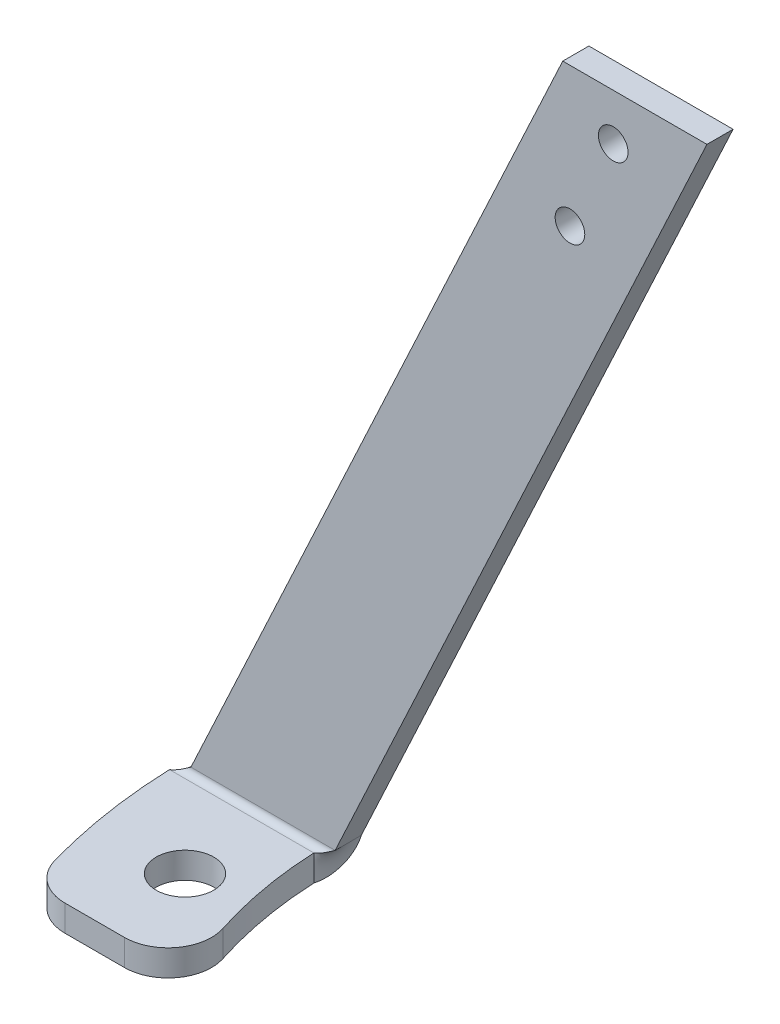
ISO-10303-21;
HEADER;
FILE_DESCRIPTION(('STEP AP214'),'2;1');
FILE_NAME('part.step','',(''),(''),'','','');
FILE_SCHEMA(('AUTOMOTIVE_DESIGN { 1 0 10303 214 1 1 1 1 }'));
ENDSEC;
DATA;
#1=APPLICATION_CONTEXT('core data for automotive mechanical design processes');
#2=APPLICATION_PROTOCOL_DEFINITION('international standard','automotive_design',2000,#1);
#3=PRODUCT_CONTEXT('',#1,'mechanical');
#4=PRODUCT('Part','Part','',(#3));
#5=PRODUCT_RELATED_PRODUCT_CATEGORY('part','',(#4));
#6=PRODUCT_DEFINITION_FORMATION('','',#4);
#7=PRODUCT_DEFINITION_CONTEXT('part definition',#1,'design');
#8=PRODUCT_DEFINITION('design','',#6,#7);
#9=PRODUCT_DEFINITION_SHAPE('','',#8);
#10=(LENGTH_UNIT() NAMED_UNIT(*) SI_UNIT(.MILLI.,.METRE.));
#11=(NAMED_UNIT(*) PLANE_ANGLE_UNIT() SI_UNIT($,.RADIAN.));
#12=(NAMED_UNIT(*) SI_UNIT($,.STERADIAN.) SOLID_ANGLE_UNIT());
#13=UNCERTAINTY_MEASURE_WITH_UNIT(LENGTH_MEASURE(1.E-05),#10,'distance_accuracy_value','');
#14=(GEOMETRIC_REPRESENTATION_CONTEXT(3) GLOBAL_UNCERTAINTY_ASSIGNED_CONTEXT((#13)) GLOBAL_UNIT_ASSIGNED_CONTEXT((#10,
#11,#12)) REPRESENTATION_CONTEXT('',''));
#15=CARTESIAN_POINT('',(0.,0.,0.));
#16=DIRECTION('',(0.,0.,1.));
#17=DIRECTION('',(1.,0.,0.));
#18=AXIS2_PLACEMENT_3D('',#15,#16,#17);
#19=CARTESIAN_POINT('',(0.,0.,1.5));
#20=DIRECTION('',(0.,0.,-1.));
#21=DIRECTION('',(-1.,0.,0.));
#22=AXIS2_PLACEMENT_3D('',#19,#20,#21);
#23=PLANE('',#22);
#24=CARTESIAN_POINT('',(-15.1911080308203,89.9268044253806,1.5));
#25=DIRECTION('',(0.,0.,1.));
#26=DIRECTION('',(1.,0.,0.));
#27=AXIS2_PLACEMENT_3D('',#24,#25,#26);
#28=CIRCLE('',#27,1.69999999999999);
#29=CARTESIAN_POINT('',(-13.4911080308203,89.9268044253806,1.5));
#30=VERTEX_POINT('',#29);
#31=EDGE_CURVE('E528',#30,#30,#28,.T.);
#32=ORIENTED_EDGE('',*,*,#31,.F.);
#33=EDGE_LOOP('',(#32));
#34=FACE_BOUND('',#33,.T.);
#35=DIRECTION('',(1.,0.,0.));
#36=VECTOR('',#35,1.);
#37=CARTESIAN_POINT('',(-47.1069260201008,3.7366,1.5));
#38=LINE('',#37,#36);
#39=CARTESIAN_POINT('',(-47.1069260201008,3.7366,1.5));
#40=VERTEX_POINT('',#39);
#41=CARTESIAN_POINT('',(-63.6575948045381,3.73659999999999,1.5));
#42=VERTEX_POINT('',#41);
#43=EDGE_CURVE('E186',#40,#42,#38,.F.);
#44=ORIENTED_EDGE('',*,*,#43,.F.);
#45=DIRECTION('',(0.422618261740693,0.906307787036653,0.));
#46=VECTOR('',#45,1.);
#47=CARTESIAN_POINT('',(-48.8493312155627,0.,1.5));
#48=LINE('',#47,#46);
#49=CARTESIAN_POINT('',(-4.43317583253723,95.2507526013277,1.5));
#50=VERTEX_POINT('',#49);
#51=EDGE_CURVE('E193',#40,#50,#48,.T.);
#52=ORIENTED_EDGE('',*,*,#51,.T.);
#53=DIRECTION('',(-1.,0.,0.));
#54=VECTOR('',#53,1.);
#55=CARTESIAN_POINT('',(-20.9838446169746,95.2507526013277,1.5));
#56=LINE('',#55,#54);
#57=CARTESIAN_POINT('',(-20.9838446169746,95.2507526013277,1.5));
#58=VERTEX_POINT('',#57);
#59=EDGE_CURVE('E302',#50,#58,#56,.T.);
#60=ORIENTED_EDGE('',*,*,#59,.T.);
#61=DIRECTION('',(-0.422618261740693,-0.906307787036653,0.));
#62=VECTOR('',#61,1.);
#63=CARTESIAN_POINT('',(-65.4,0.,1.5));
#64=LINE('',#63,#62);
#65=EDGE_CURVE('E299',#58,#42,#64,.T.);
#66=ORIENTED_EDGE('',*,*,#65,.T.);
#67=EDGE_LOOP('',(#44,#52,#60,#66));
#68=FACE_BOUND('',#67,.T.);
#69=CARTESIAN_POINT('',(-20.1563036429491,79.2789080734865,1.5));
#70=DIRECTION('',(0.,0.,1.));
#71=DIRECTION('',(1.,0.,0.));
#72=AXIS2_PLACEMENT_3D('',#69,#70,#71);
#73=CIRCLE('',#72,1.69999999999999);
#74=CARTESIAN_POINT('',(-18.4563036429491,79.2789080734865,1.5));
#75=VERTEX_POINT('',#74);
#76=EDGE_CURVE('E524',#75,#75,#73,.T.);
#77=ORIENTED_EDGE('',*,*,#76,.F.);
#78=EDGE_LOOP('',(#77));
#79=FACE_BOUND('',#78,.T.);
#80=ADVANCED_FACE('F61',(#34,#68,#79),#23,.F.);
#81=CARTESIAN_POINT('',(0.,3.00000000000001,0.));
#82=DIRECTION('',(0.,-1.,0.));
#83=DIRECTION('',(0.,0.,-1.));
#84=AXIS2_PLACEMENT_3D('',#81,#82,#83);
#85=PLANE('',#84);
#86=DIRECTION('',(-1.,0.,0.));
#87=VECTOR('',#86,1.);
#88=CARTESIAN_POINT('',(-61.7831692291679,2.99999999999993,21.5));
#89=LINE('',#88,#87);
#90=CARTESIAN_POINT('',(-51.283337626187,2.99999999999993,21.5));
#91=VERTEX_POINT('',#90);
#92=CARTESIAN_POINT('',(-58.1204611498222,2.99999999999993,21.5));
#93=VERTEX_POINT('',#92);
#94=EDGE_CURVE('E172',#91,#93,#89,.T.);
#95=ORIENTED_EDGE('',*,*,#94,.F.);
#96=CARTESIAN_POINT('',(-51.283337626187,2.99999999999995,16.5));
#97=DIRECTION('',(0.,-1.,0.));
#98=DIRECTION('',(0.,0.,-1.));
#99=AXIS2_PLACEMENT_3D('',#96,#97,#98);
#100=CIRCLE('',#99,5.);
#101=CARTESIAN_POINT('',(-46.5236295276036,2.99999999999995,14.9686023324168));
#102=VERTEX_POINT('',#101);
#103=EDGE_CURVE('E286',#91,#102,#100,.F.);
#104=ORIENTED_EDGE('',*,*,#103,.T.);
#105=CARTESIAN_POINT('',(0.,3.00000000000001,0.));
#106=DIRECTION('',(0.,-1.,0.));
#107=DIRECTION('',(0.,0.,-1.));
#108=AXIS2_PLACEMENT_3D('',#105,#106,#107);
#109=CIRCLE('',#108,48.8723557873748);
#110=CARTESIAN_POINT('',(-48.821150955787,3.,2.2366));
#111=VERTEX_POINT('',#110);
#112=EDGE_CURVE('E178',#111,#102,#109,.F.);
#113=ORIENTED_EDGE('',*,*,#112,.F.);
#114=DIRECTION('',(-1.,0.,0.));
#115=VECTOR('',#114,1.);
#116=CARTESIAN_POINT('',(-65.378953956453,3.,2.2366));
#117=LINE('',#116,#115);
#118=CARTESIAN_POINT('',(-65.378953956453,3.,2.2366));
#119=VERTEX_POINT('',#118);
#120=EDGE_CURVE('E160',#119,#111,#117,.F.);
#121=ORIENTED_EDGE('',*,*,#120,.F.);
#122=CARTESIAN_POINT('',(0.,3.00000000000001,0.));
#123=DIRECTION('',(0.,-1.,0.));
#124=DIRECTION('',(0.,0.,-1.));
#125=AXIS2_PLACEMENT_3D('',#122,#123,#124);
#126=CIRCLE('',#125,65.4171995732009);
#127=CARTESIAN_POINT('',(-62.9303879223635,2.99999999999994,17.8655051969108));
#128=VERTEX_POINT('',#127);
#129=EDGE_CURVE('E166',#128,#119,#126,.T.);
#130=ORIENTED_EDGE('',*,*,#129,.F.);
#131=CARTESIAN_POINT('',(-58.1204611498222,2.99999999999995,16.5));
#132=DIRECTION('',(0.,-1.,0.));
#133=DIRECTION('',(0.,0.,-1.));
#134=AXIS2_PLACEMENT_3D('',#131,#132,#133);
#135=CIRCLE('',#134,5.);
#136=EDGE_CURVE('E288',#128,#93,#135,.F.);
#137=ORIENTED_EDGE('',*,*,#136,.T.);
#138=EDGE_LOOP('',(#95,#104,#113,#121,#130,#137));
#139=FACE_BOUND('',#138,.T.);
#140=CARTESIAN_POINT('',(-54.1530535425231,2.99999999999996,11.6878908285725));
#141=DIRECTION('',(0.,1.,0.));
#142=DIRECTION('',(0.,0.,1.));
#143=AXIS2_PLACEMENT_3D('',#140,#141,#142);
#144=CIRCLE('',#143,3.29999999999998);
#145=CARTESIAN_POINT('',(-54.1530535425231,2.99999999999995,14.9878908285724));
#146=VERTEX_POINT('',#145);
#147=EDGE_CURVE('E537',#146,#146,#144,.T.);
#148=ORIENTED_EDGE('',*,*,#147,.F.);
#149=EDGE_LOOP('',(#148));
#150=FACE_BOUND('',#149,.T.);
#151=ADVANCED_FACE('F255',(#139,#150),#85,.F.);
#152=CARTESIAN_POINT('',(-65.4,0.,-1.5));
#153=DIRECTION('',(-0.906307787036653,0.422618261740693,0.));
#154=DIRECTION('',(-0.422618261740693,-0.906307787036653,0.));
#155=AXIS2_PLACEMENT_3D('',#152,#153,#154);
#156=PLANE('',#155);
#157=DIRECTION('',(-0.422618261740693,-0.906307787036653,0.));
#158=VECTOR('',#157,1.);
#159=CARTESIAN_POINT('',(-65.4,0.,-1.5));
#160=LINE('',#159,#158);
#161=CARTESIAN_POINT('',(-20.9838446169746,95.2507526013277,-1.5));
#162=VERTEX_POINT('',#161);
#163=CARTESIAN_POINT('',(-63.6575948045381,3.73660000000001,-1.5));
#164=VERTEX_POINT('',#163);
#165=EDGE_CURVE('E297',#162,#164,#160,.T.);
#166=ORIENTED_EDGE('',*,*,#165,.T.);
#167=DIRECTION('',(0.,0.,-1.));
#168=VECTOR('',#167,1.);
#169=CARTESIAN_POINT('',(-63.6575948045381,3.73659999999999,1.5));
#170=LINE('',#169,#168);
#171=EDGE_CURVE('E190',#42,#164,#170,.T.);
#172=ORIENTED_EDGE('',*,*,#171,.F.);
#173=ORIENTED_EDGE('',*,*,#65,.F.);
#174=DIRECTION('',(0.,0.,1.));
#175=VECTOR('',#174,1.);
#176=CARTESIAN_POINT('',(-20.9838446169746,95.2507526013277,-1.5));
#177=LINE('',#176,#175);
#178=EDGE_CURVE('E293',#162,#58,#177,.T.);
#179=ORIENTED_EDGE('',*,*,#178,.F.);
#180=EDGE_LOOP('',(#166,#172,#173,#179));
#181=FACE_BOUND('',#180,.T.);
#182=ADVANCED_FACE('F257',(#181),#156,.T.);
#183=CARTESIAN_POINT('',(-48.8493312155627,0.,-1.5));
#184=DIRECTION('',(0.906307787036653,-0.422618261740693,0.));
#185=DIRECTION('',(0.422618261740693,0.906307787036653,0.));
#186=AXIS2_PLACEMENT_3D('',#183,#184,#185);
#187=PLANE('',#186);
#188=ORIENTED_EDGE('',*,*,#51,.F.);
#189=DIRECTION('',(0.,0.,-1.));
#190=VECTOR('',#189,1.);
#191=CARTESIAN_POINT('',(-47.1069260201008,3.7366,1.5));
#192=LINE('',#191,#190);
#193=CARTESIAN_POINT('',(-47.1069260201008,3.73659999999999,-1.5));
#194=VERTEX_POINT('',#193);
#195=EDGE_CURVE('E194',#40,#194,#192,.T.);
#196=ORIENTED_EDGE('',*,*,#195,.T.);
#197=DIRECTION('',(0.422618261740693,0.906307787036653,0.));
#198=VECTOR('',#197,1.);
#199=CARTESIAN_POINT('',(-48.8493312155627,0.,-1.5));
#200=LINE('',#199,#198);
#201=CARTESIAN_POINT('',(-4.43317583253723,95.2507526013277,-1.5));
#202=VERTEX_POINT('',#201);
#203=EDGE_CURVE('E234',#194,#202,#200,.T.);
#204=ORIENTED_EDGE('',*,*,#203,.T.);
#205=DIRECTION('',(0.,0.,1.));
#206=VECTOR('',#205,1.);
#207=CARTESIAN_POINT('',(-4.43317583253723,95.2507526013277,-1.5));
#208=LINE('',#207,#206);
#209=EDGE_CURVE('E294',#202,#50,#208,.T.);
#210=ORIENTED_EDGE('',*,*,#209,.T.);
#211=EDGE_LOOP('',(#188,#196,#204,#210));
#212=FACE_BOUND('',#211,.T.);
#213=ADVANCED_FACE('F251',(#212),#187,.T.);
#214=CARTESIAN_POINT('',(0.,0.,-1.5));
#215=DIRECTION('',(0.,0.,-1.));
#216=DIRECTION('',(-1.,0.,0.));
#217=AXIS2_PLACEMENT_3D('',#214,#215,#216);
#218=PLANE('',#217);
#219=CARTESIAN_POINT('',(-20.1563036429491,79.2789080734865,-1.5));
#220=DIRECTION('',(0.,0.,-1.));
#221=DIRECTION('',(-1.,0.,0.));
#222=AXIS2_PLACEMENT_3D('',#219,#220,#221);
#223=CIRCLE('',#222,1.69999999999999);
#224=CARTESIAN_POINT('',(-21.8563036429491,79.2789080734865,-1.5));
#225=VERTEX_POINT('',#224);
#226=EDGE_CURVE('E527',#225,#225,#223,.T.);
#227=ORIENTED_EDGE('',*,*,#226,.F.);
#228=EDGE_LOOP('',(#227));
#229=FACE_BOUND('',#228,.T.);
#230=CARTESIAN_POINT('',(-15.1911080308203,89.9268044253806,-1.5));
#231=DIRECTION('',(0.,0.,-1.));
#232=DIRECTION('',(-1.,0.,0.));
#233=AXIS2_PLACEMENT_3D('',#230,#231,#232);
#234=CIRCLE('',#233,1.69999999999999);
#235=CARTESIAN_POINT('',(-16.8911080308203,89.9268044253806,-1.5));
#236=VERTEX_POINT('',#235);
#237=EDGE_CURVE('E531',#236,#236,#234,.T.);
#238=ORIENTED_EDGE('',*,*,#237,.F.);
#239=EDGE_LOOP('',(#238));
#240=FACE_BOUND('',#239,.T.);
#241=ORIENTED_EDGE('',*,*,#203,.F.);
#242=DIRECTION('',(1.,0.,0.));
#243=VECTOR('',#242,1.);
#244=CARTESIAN_POINT('',(-47.1069260201008,3.73659999999999,-1.5));
#245=LINE('',#244,#243);
#246=EDGE_CURVE('E148',#194,#164,#245,.F.);
#247=ORIENTED_EDGE('',*,*,#246,.T.);
#248=ORIENTED_EDGE('',*,*,#165,.F.);
#249=DIRECTION('',(-1.,0.,0.));
#250=VECTOR('',#249,1.);
#251=CARTESIAN_POINT('',(-20.9838446169746,95.2507526013277,-1.5));
#252=LINE('',#251,#250);
#253=EDGE_CURVE('E307',#202,#162,#252,.T.);
#254=ORIENTED_EDGE('',*,*,#253,.F.);
#255=EDGE_LOOP('',(#241,#247,#248,#254));
#256=FACE_BOUND('',#255,.T.);
#257=ADVANCED_FACE('F241',(#229,#240,#256),#218,.T.);
#258=CARTESIAN_POINT('',(-20.9838446169746,95.2507526013277,-1.5));
#259=DIRECTION('',(0.,1.,0.));
#260=DIRECTION('',(0.,0.,1.));
#261=AXIS2_PLACEMENT_3D('',#258,#259,#260);
#262=PLANE('',#261);
#263=ORIENTED_EDGE('',*,*,#59,.F.);
#264=ORIENTED_EDGE('',*,*,#209,.F.);
#265=ORIENTED_EDGE('',*,*,#253,.T.);
#266=ORIENTED_EDGE('',*,*,#178,.T.);
#267=EDGE_LOOP('',(#263,#264,#265,#266));
#268=FACE_BOUND('',#267,.T.);
#269=ADVANCED_FACE('F250',(#268),#262,.T.);
#270=CARTESIAN_POINT('',(-63.6575948045381,3.7366,-1.53));
#271=CARTESIAN_POINT('',(-63.8010653729121,3.24347125232665,-1.52999999999999));
#272=CARTESIAN_POINT('',(-63.9444879965239,2.75070041877233,-1.43196548393888));
#273=CARTESIAN_POINT('',(-64.2313811885097,1.83966874853497,-1.05460381037515));
#274=CARTESIAN_POINT('',(-64.3748277845026,1.42184832454248,-0.775425128576993));
#275=CARTESIAN_POINT('',(-64.6617209764885,0.72457487142302,-0.078151675457517));
#276=CARTESIAN_POINT('',(-64.8051675724814,0.445396189624848,0.33966874853496));
#277=CARTESIAN_POINT('',(-65.0920607644672,0.0680345160611267,1.25070041877233));
#278=CARTESIAN_POINT('',(-65.2354833880789,-0.0300000000000083,1.74347125232663));
#279=CARTESIAN_POINT('',(-65.378953956453,-0.0300000000000043,2.23659999999999));
#280=CARTESIAN_POINT('',(-63.6575948045381,3.7366,-1.5));
#281=CARTESIAN_POINT('',(-63.8010652152524,3.24739900106928,-1.49999999999999));
#282=CARTESIAN_POINT('',(-63.9444879965239,2.75855285530311,-1.40274630363883));
#283=CARTESIAN_POINT('',(-64.2313811885097,1.8547773179461,-1.02839021872452));
#284=CARTESIAN_POINT('',(-64.3748277845026,1.44028472614173,-0.751435123305048));
#285=CARTESIAN_POINT('',(-64.6617209764885,0.748564876694966,-0.0597152738582695));
#286=CARTESIAN_POINT('',(-64.8051675724814,0.471609781275476,0.354777317946087));
#287=CARTESIAN_POINT('',(-65.0920607644672,0.0972536963611761,1.25855285530311));
#288=CARTESIAN_POINT('',(-65.2354835457386,0.,1.74739900106926));
#289=CARTESIAN_POINT('',(-65.378953956453,0.,2.23659999999999));
#290=CARTESIAN_POINT('',(-63.6575948045381,3.7366,1.5));
#291=CARTESIAN_POINT('',(-63.8010494492816,3.64017387533275,1.5));
#292=CARTESIAN_POINT('',(-63.9444879965239,3.54379650838095,1.51917172636612));
#293=CARTESIAN_POINT('',(-64.2313811885097,3.36563425905879,1.59296894633825));
#294=CARTESIAN_POINT('',(-64.3748277845026,3.28392488606647,1.6475654038895));
#295=CARTESIAN_POINT('',(-64.6617209764884,3.1475654038895,1.78392488606648));
#296=CARTESIAN_POINT('',(-64.8051675724813,3.09296894633825,1.86563425905879));
#297=CARTESIAN_POINT('',(-65.0920607644671,3.01917172636611,2.04379650838095));
#298=CARTESIAN_POINT('',(-65.2354993117094,3.,2.14017387533276));
#299=CARTESIAN_POINT('',(-65.378953956453,3.,2.2366));
#300=CARTESIAN_POINT('',(-63.6575948045381,3.7366,1.5303));
#301=CARTESIAN_POINT('',(-63.8010492900453,3.64414090156282,1.5303));
#302=CARTESIAN_POINT('',(-63.9444879965239,3.55172746927704,1.54868309846917));
#303=CARTESIAN_POINT('',(-64.2313811885097,3.38089391416403,1.61944467390539));
#304=CARTESIAN_POINT('',(-64.3748277845026,3.30254565168171,1.67179530921417));
#305=CARTESIAN_POINT('',(-64.6617209764884,3.17179530921416,1.80254565168172));
#306=CARTESIAN_POINT('',(-64.8051675724813,3.11944467390538,1.88089391416403));
#307=CARTESIAN_POINT('',(-65.0920607644671,3.04868309846916,2.05172746927704));
#308=CARTESIAN_POINT('',(-65.2354994709458,3.0303,2.14414090156282));
#309=CARTESIAN_POINT('',(-65.378953956453,3.0303,2.2366));
#310=B_SPLINE_SURFACE_WITH_KNOTS('',1,3,((#270,#271,#272,#273,#274,#275,#276,#277,#278,#279),
(#280,#281,#282,#283,#284,#285,#286,#287,#288,#289),(#290,#291,#292,#293,#294,#295,#296,#297,
#298,#299),(#300,#301,#302,#303,#304,#305,#306,#307,#308,#309)),.UNSPECIFIED.,.F.,.F.,.F.,(2,1,
1,2),(4,2,2,2,4),(-0.01,0.,1.,1.0101),(0.,0.25,0.5,0.75,1.),.UNSPECIFIED.);
#311=DIRECTION('',(0.,1.,0.));
#312=VECTOR('',#311,1.);
#313=CARTESIAN_POINT('',(-65.378953956453,0.,2.23659999999999));
#314=LINE('',#313,#312);
#315=CARTESIAN_POINT('',(-65.378953956453,0.,2.23659999999999));
#316=VERTEX_POINT('',#315);
#317=EDGE_CURVE('E182',#119,#316,#314,.F.);
#318=CARTESIAN_POINT('',(-63.6575948045381,3.7366,1.5));
#319=CARTESIAN_POINT('',(-63.7094540584731,3.70174262650707,1.49998183869658));
#320=CARTESIAN_POINT('',(-63.7613114665011,3.66688708610997,1.50247330554281));
#321=CARTESIAN_POINT('',(-63.8650174257144,3.59787910615516,1.51234622591955));
#322=CARTESIAN_POINT('',(-63.9168659770296,3.563726558735,1.51972692342588));
#323=CARTESIAN_POINT('',(-64.0204509553327,3.49688644043288,1.53922762264163));
#324=CARTESIAN_POINT('',(-64.0721873778994,3.46419581022817,1.55133715608789));
#325=CARTESIAN_POINT('',(-64.1756589136946,3.40084981690136,1.58004821482417));
#326=CARTESIAN_POINT('',(-64.2273940269087,3.37019447063802,1.59664977731699));
#327=CARTESIAN_POINT('',(-64.334720348867,3.3093475292701,1.6354088619498));
#328=CARTESIAN_POINT('',(-64.3903117726647,3.27936052559894,1.65788809723041));
#329=CARTESIAN_POINT('',(-64.5014970888253,3.22314274987469,1.70713046047534));
#330=CARTESIAN_POINT('',(-64.5570909812073,3.19691210715392,1.73389373587292));
#331=CARTESIAN_POINT('',(-64.6682358659156,3.14882762635415,1.79107022319673));
#332=CARTESIAN_POINT('',(-64.7237868584239,3.12697044494753,1.8214806183879));
#333=CARTESIAN_POINT('',(-64.834868057315,3.08812153784614,1.88524534005774));
#334=CARTESIAN_POINT('',(-64.8903982652754,3.07112850809172,1.91859887434951));
#335=CARTESIAN_POINT('',(-65.0180862679442,3.03809647755497,1.9978132667406));
#336=CARTESIAN_POINT('',(-65.0902536770476,3.02386030095106,2.04443306178193));
#337=CARTESIAN_POINT('',(-65.1984814700077,3.00957220850817,2.1157651326868));
#338=CARTESIAN_POINT('',(-65.2345688577371,3.00598718691072,2.13978673485153));
#339=CARTESIAN_POINT('',(-65.3067522645604,3.00119993222567,2.18807065877309));
#340=CARTESIAN_POINT('',(-65.342848283793,2.99999822793541,2.21233303275121));
#341=CARTESIAN_POINT('',(-65.378953956453,3.,2.2366));
#342=B_SPLINE_CURVE_WITH_KNOTS('',3,(#318,#319,#320,#321,#322,#323,#324,#325,#326,#327,#328,
#329,#330,#331,#332,#333,#334,#335,#336,#337,#338,#339,#340,#341),.UNSPECIFIED.,.F.,.F.,(4,2,2,
2,2,2,2,2,2,2,2,4),(0.,0.187402747728592,0.374776524039295,0.561737839639067,0.748700703691864,
0.94958847831167,1.1504831678784,1.35122369016394,1.55191034420231,1.81257297532641,
1.94301529622907,2.07348655571983),.UNSPECIFIED.);
#343=EDGE_CURVE('E151',#42,#119,#342,.T.);
#344=CARTESIAN_POINT('',(-63.6575948045381,3.7366,-1.5));
#345=CARTESIAN_POINT('',(-63.6939919517891,3.61250108011331,-1.50002219994067));
#346=CARTESIAN_POINT('',(-63.7303875043355,3.4884047034615,-1.49381873372379));
#347=CARTESIAN_POINT('',(-63.8031781211656,3.24143559409057,-1.46911834068656));
#348=CARTESIAN_POINT('',(-63.8395731853786,3.11856290788103,-1.45062094839947));
#349=CARTESIAN_POINT('',(-63.9122844320593,2.87553116045294,-1.40154347293247));
#350=CARTESIAN_POINT('',(-63.948600615695,2.75536682753058,-1.37098948303962));
#351=CARTESIAN_POINT('',(-64.0212313116171,2.51867910916847,-1.29810984196252));
#352=CARTESIAN_POINT('',(-64.0575458232616,2.40215515169785,-1.25578605068187));
#353=CARTESIAN_POINT('',(-64.1259806812206,2.18706471118672,-1.16532897137244));
#354=CARTESIAN_POINT('',(-64.1581016091723,2.08797731731415,-1.11842905796962));
#355=CARTESIAN_POINT('',(-64.2223527999288,1.89426886114355,-1.01609064369933));
#356=CARTESIAN_POINT('',(-64.2544830624382,1.7996492355315,-0.960649420333107));
#357=CARTESIAN_POINT('',(-64.318715851336,1.61572274838987,-0.841718286173675));
#358=CARTESIAN_POINT('',(-64.3508183788045,1.52641158180847,-0.778235031849663));
#359=CARTESIAN_POINT('',(-64.4150376094801,1.35367682551157,-0.643651408440645));
#360=CARTESIAN_POINT('',(-64.4471543137571,1.27025527750064,-0.572548419184982));
#361=CARTESIAN_POINT('',(-64.5113785843655,1.10999916278105,-0.423312173512852));
#362=CARTESIAN_POINT('',(-64.5434861508348,1.03316283317731,-0.345180810178223));
#363=CARTESIAN_POINT('',(-64.6077013346846,0.886645323862384,-0.182474844461514));
#364=CARTESIAN_POINT('',(-64.6398089520653,0.816964144036654,-0.0979002421825736));
#365=CARTESIAN_POINT('',(-64.7040437941434,0.685248470612406,0.0771011445314289));
#366=CARTESIAN_POINT('',(-64.7361710168688,0.623219352970279,0.167531976005778));
#367=CARTESIAN_POINT('',(-64.8004162317726,0.507365193594115,0.353460102938804));
#368=CARTESIAN_POINT('',(-64.8325342232771,0.45353730719477,0.448955626102212));
#369=CARTESIAN_POINT('',(-64.8967990735652,0.354432442814697,0.644388761040678));
#370=CARTESIAN_POINT('',(-64.9289459332672,0.309162908180538,0.744330147003763));
#371=CARTESIAN_POINT('',(-64.9932281588634,0.22759802476793,0.947767317838212));
#372=CARTESIAN_POINT('',(-65.0253635245565,0.191299323713648,1.05126175846658));
#373=CARTESIAN_POINT('',(-65.0895954931671,0.127969988538236,1.26092135889337));
#374=CARTESIAN_POINT('',(-65.1216920995756,0.100929128076407,1.36708343188351));
#375=CARTESIAN_POINT('',(-65.1858723112879,0.0562785803680835,1.5813296862266));
#376=CARTESIAN_POINT('',(-65.2179559155359,0.0386644250594487,1.68941293183917));
#377=CARTESIAN_POINT('',(-65.2715409120728,0.0172189018763896,1.87086351253552));
#378=CARTESIAN_POINT('',(-65.2930443328298,0.0107581733341985,1.94392997975947));
#379=CARTESIAN_POINT('',(-65.3360158590532,0.00215151104489334,2.09019525008157));
#380=CARTESIAN_POINT('',(-65.3574839641217,-1.53957669645325E-06,2.16339363459187));
#381=CARTESIAN_POINT('',(-65.378953956453,0.,2.23659999999999));
#382=B_SPLINE_CURVE_WITH_KNOTS('',3,(#344,#345,#346,#347,#348,#349,#350,#351,#352,#353,#354,
#355,#356,#357,#358,#359,#360,#361,#362,#363,#364,#365,#366,#367,#368,#369,#370,#371,#372,#373,
#374,#375,#376,#377,#378,#379,#380,#381),.UNSPECIFIED.,.F.,.F.,(4,2,2,2,2,2,2,2,2,2,2,2,2,2,2,2,
2,2,4),(0.,0.387826573543423,0.775667831627336,1.16267427442174,1.54961959587411,
1.89192817099319,2.23434608182377,2.57648239946196,2.91873674609546,3.26089918150039,
3.60306161142814,3.94546307488295,4.28774550183165,4.63032426186493,4.97277481074862,
5.31484585415901,5.65675461909339,5.88595637542342,6.11477914529787),.UNSPECIFIED.);
#383=EDGE_CURVE('E189',#164,#316,#382,.T.);
#384=ORIENTED_EDGE('',*,*,#317,.F.);
#385=ORIENTED_EDGE('',*,*,#343,.F.);
#386=ORIENTED_EDGE('',*,*,#171,.T.);
#387=ORIENTED_EDGE('',*,*,#383,.T.);
#388=EDGE_LOOP('',(#384,#385,#386,#387));
#389=FACE_BOUND('',#388,.T.);
#390=ADVANCED_FACE('F208',(#389),#310,.F.);
#391=CARTESIAN_POINT('',(-48.821150955787,-0.0299999999999996,2.23659999999999));
#392=CARTESIAN_POINT('',(-48.678274989543,-0.0299999999999987,1.74347119887205));
#393=CARTESIAN_POINT('',(-48.5354467998393,0.0680345160611246,1.25070041877233));
#394=CARTESIAN_POINT('',(-48.2497426438916,0.445396189624853,0.339668748534968));
#395=CARTESIAN_POINT('',(-48.1068905659177,0.724574871423015,-0.0781516754575142));
#396=CARTESIAN_POINT('',(-47.82118640997,1.42184832454248,-0.775425128576983));
#397=CARTESIAN_POINT('',(-47.6783343319962,1.83966874853497,-1.05460381037515));
#398=CARTESIAN_POINT('',(-47.3926301760485,2.75070041877233,-1.43196548393887));
#399=CARTESIAN_POINT('',(-47.2498019863448,3.24347119887204,-1.53));
#400=CARTESIAN_POINT('',(-47.1069260201008,3.73659999999999,-1.53));
#401=CARTESIAN_POINT('',(-48.821150955787,0.,2.23659999999999));
#402=CARTESIAN_POINT('',(-48.6782751462455,0.,1.747398947837));
#403=CARTESIAN_POINT('',(-48.5354467998393,0.0972536963611741,1.25855285530311));
#404=CARTESIAN_POINT('',(-48.2497426438916,0.471609781275481,0.354777317946095));
#405=CARTESIAN_POINT('',(-48.1068905659177,0.748564876694961,-0.0597152738582667));
#406=CARTESIAN_POINT('',(-47.82118640997,1.44028472614173,-0.751435123305037));
#407=CARTESIAN_POINT('',(-47.6783343319962,1.8547773179461,-1.02839021872452));
#408=CARTESIAN_POINT('',(-47.3926301760485,2.75855285530311,-1.40274630363883));
#409=CARTESIAN_POINT('',(-47.2498018296423,3.24739894783698,-1.5));
#410=CARTESIAN_POINT('',(-47.1069260201008,3.73659999999999,-1.5));
#411=CARTESIAN_POINT('',(-48.821150955787,3.,2.2366));
#412=CARTESIAN_POINT('',(-48.6782908164905,3.,2.14017384433123));
#413=CARTESIAN_POINT('',(-48.5354467998393,3.01917172636612,2.04379650838095));
#414=CARTESIAN_POINT('',(-48.2497426438916,3.09296894633825,1.8656342590588));
#415=CARTESIAN_POINT('',(-48.1068905659177,3.1475654038895,1.78392488606648));
#416=CARTESIAN_POINT('',(-47.82118640997,3.28392488606648,1.6475654038895));
#417=CARTESIAN_POINT('',(-47.6783343319962,3.3656342590588,1.59296894633826));
#418=CARTESIAN_POINT('',(-47.3926301760485,3.54379650838095,1.51917172636612));
#419=CARTESIAN_POINT('',(-47.2497861593973,3.64017384433122,1.5));
#420=CARTESIAN_POINT('',(-47.1069260201008,3.7366,1.5));
#421=CARTESIAN_POINT('',(-48.821150955787,3.0303,2.2366));
#422=CARTESIAN_POINT('',(-48.67829097476,3.0303,2.14414087078582));
#423=CARTESIAN_POINT('',(-48.5354467998393,3.04868309846917,2.05172746927704));
#424=CARTESIAN_POINT('',(-48.2497426438916,3.11944467390539,1.88089391416403));
#425=CARTESIAN_POINT('',(-48.1068905659177,3.17179530921417,1.80254565168172));
#426=CARTESIAN_POINT('',(-47.82118640997,3.30254565168172,1.67179530921417));
#427=CARTESIAN_POINT('',(-47.6783343319962,3.38089391416403,1.61944467390539));
#428=CARTESIAN_POINT('',(-47.3926301760485,3.55172746927704,1.54868309846917));
#429=CARTESIAN_POINT('',(-47.2497860011278,3.64414087078581,1.5303));
#430=CARTESIAN_POINT('',(-47.1069260201008,3.7366,1.5303));
#431=B_SPLINE_SURFACE_WITH_KNOTS('',1,3,((#391,#392,#393,#394,#395,#396,#397,#398,#399,#400),
(#401,#402,#403,#404,#405,#406,#407,#408,#409,#410),(#411,#412,#413,#414,#415,#416,#417,#418,
#419,#420),(#421,#422,#423,#424,#425,#426,#427,#428,#429,#430)),.UNSPECIFIED.,.F.,.F.,.F.,(2,1,
1,2),(4,2,2,2,4),(-0.01,0.,1.,1.0101),(0.,0.25,0.5,0.75,1.),.UNSPECIFIED.);
#432=CARTESIAN_POINT('',(-48.821150955787,3.,2.2366));
#433=CARTESIAN_POINT('',(-48.7693471977032,2.99998161243939,2.20163497621657));
#434=CARTESIAN_POINT('',(-48.717545284105,3.00248859595708,2.16667184857083));
#435=CARTESIAN_POINT('',(-48.6139502150926,3.01242243576328,2.09745513011396));
#436=CARTESIAN_POINT('',(-48.5621570595502,3.01984853982646,2.06320143164364));
#437=CARTESIAN_POINT('',(-48.4586857192279,3.03946764463643,1.99617397583387));
#438=CARTESIAN_POINT('',(-48.4070075389843,3.05164984106212,1.96339705065739));
#439=CARTESIAN_POINT('',(-48.303652718346,3.08053086303487,1.89989681878017));
#440=CARTESIAN_POINT('',(-48.2519760779572,3.09722970417186,1.8691735191683));
#441=CARTESIAN_POINT('',(-48.1450949134606,3.13609412699651,1.80839406161189));
#442=CARTESIAN_POINT('',(-48.0898902073357,3.15855492367118,1.77852638583228));
#443=CARTESIAN_POINT('',(-47.9794784057923,3.20773132348637,1.72253155468474));
#444=CARTESIAN_POINT('',(-47.9242713103543,3.23444706430874,1.69640452040878));
#445=CARTESIAN_POINT('',(-47.8139002232315,3.29150374581339,1.64850597147294));
#446=CARTESIAN_POINT('',(-47.7587362313505,3.32184185657715,1.62673109186758));
#447=CARTESIAN_POINT('',(-47.6484288254794,3.38544312257047,1.5880204903693));
#448=CARTESIAN_POINT('',(-47.5932854099231,3.41870549619392,1.57108348050705));
#449=CARTESIAN_POINT('',(-47.4662864062033,3.49782079711678,1.5380940741531));
#450=CARTESIAN_POINT('',(-47.3944210533264,3.54443878741088,1.52385891510665));
#451=CARTESIAN_POINT('',(-47.2866458944644,3.61576822673939,1.5095717087161));
#452=CARTESIAN_POINT('',(-47.2507090111317,3.63978921354532,1.50598687529682));
#453=CARTESIAN_POINT('',(-47.1788266517931,3.68807188681229,1.50119987635446));
#454=CARTESIAN_POINT('',(-47.1428811756483,3.71233362545034,1.49999823918862));
#455=CARTESIAN_POINT('',(-47.1069260201008,3.7366,1.5));
#456=B_SPLINE_CURVE_WITH_KNOTS('',3,(#432,#433,#434,#435,#436,#437,#438,#439,#440,#441,#442,
#443,#444,#445,#446,#447,#448,#449,#450,#451,#452,#453,#454,#455),.UNSPECIFIED.,.F.,.F.,(4,2,2,
2,2,2,2,2,2,2,2,4),(0.,0.18744442598842,0.374860194840617,0.561852669339939,0.748845789282252,
0.948594983160178,1.14835064185344,1.34795125333699,1.54749867620734,1.80740560270596,
1.93747237889954,2.06756798781934),.UNSPECIFIED.);
#457=EDGE_CURVE('E158',#111,#40,#456,.T.);
#458=DIRECTION('',(0.,1.,0.));
#459=VECTOR('',#458,1.);
#460=CARTESIAN_POINT('',(-48.821150955787,0.,2.23659999999999));
#461=LINE('',#460,#459);
#462=CARTESIAN_POINT('',(-48.821150955787,0.,2.23659999999999));
#463=VERTEX_POINT('',#462);
#464=EDGE_CURVE('E155',#111,#463,#461,.F.);
#465=CARTESIAN_POINT('',(-48.821150955787,0.,2.23659999999999));
#466=CARTESIAN_POINT('',(-48.784891394117,-2.22335623158011E-05,2.11245567480524));
#467=CARTESIAN_POINT('',(-48.7486334245018,0.00618578899011474,1.98831389790535));
#468=CARTESIAN_POINT('',(-48.6761179511495,0.0309042462490196,1.74125526050227));
#469=CARTESIAN_POINT('',(-48.639860447484,0.0494151543802414,1.61833844732141));
#470=CARTESIAN_POINT('',(-48.5674243365942,0.0985281317508063,1.3752222930822));
#471=CARTESIAN_POINT('',(-48.531245728208,0.129103983411545,1.2550176531949));
#472=CARTESIAN_POINT('',(-48.4588902049213,0.202035366691331,1.0182532762959));
#473=CARTESIAN_POINT('',(-48.422713290665,0.244389026032633,0.901692963231521));
#474=CARTESIAN_POINT('',(-48.3545597014486,0.33488020484175,0.686608097538275));
#475=CARTESIAN_POINT('',(-48.322582440716,0.381777461297062,0.587559500299532));
#476=CARTESIAN_POINT('',(-48.258618635898,0.484104415740673,0.393926670943726));
#477=CARTESIAN_POINT('',(-48.2266320921066,0.539536831817705,0.299343873577412));
#478=CARTESIAN_POINT('',(-48.1626866360471,0.658444520554784,0.115488329944424));
#479=CARTESIAN_POINT('',(-48.1307277227058,0.721913135689962,0.0262112771207772));
#480=CARTESIAN_POINT('',(-48.066795782744,0.856462119969785,-0.146458727001647));
#481=CARTESIAN_POINT('',(-48.034822755058,0.927545107339176,-0.229849637876062));
#482=CARTESIAN_POINT('',(-47.9708857728255,1.07673656974876,-0.390048694000638));
#483=CARTESIAN_POINT('',(-47.9389218181418,1.15484315866914,-0.466858595761294));
#484=CARTESIAN_POINT('',(-47.8749938570806,1.31749533285532,-0.613327975786553));
#485=CARTESIAN_POINT('',(-47.8430298507032,1.40204091801596,-0.682987454167936));
#486=CARTESIAN_POINT('',(-47.7790823329303,1.57698061855223,-0.814664929246472));
#487=CARTESIAN_POINT('',(-47.7470988234979,1.66737877607432,-0.876677556815098));
#488=CARTESIAN_POINT('',(-47.6831409967084,1.8532386863802,-0.992504450388759));
#489=CARTESIAN_POINT('',(-47.6511666800212,1.9486986678674,-1.04632155907862));
#490=CARTESIAN_POINT('',(-47.5871893337501,2.14405847378494,-1.14541087347988));
#491=CARTESIAN_POINT('',(-47.5551863032479,2.24396206636751,-1.19067564937399));
#492=CARTESIAN_POINT('',(-47.4911916868455,2.44732233572926,-1.27223737220524));
#493=CARTESIAN_POINT('',(-47.4592001011442,2.55077766884486,-1.30853766883764));
#494=CARTESIAN_POINT('',(-47.3952554465526,2.76035881695787,-1.37187677511245));
#495=CARTESIAN_POINT('',(-47.363302374202,2.86648155130739,-1.39892578528035));
#496=CARTESIAN_POINT('',(-47.2994091770964,3.08064951886353,-1.44359918676904));
#497=CARTESIAN_POINT('',(-47.2674690533812,3.18869381721504,-1.46122803810849));
#498=CARTESIAN_POINT('',(-47.2140794630971,3.37023075975871,-1.48272133267901));
#499=CARTESIAN_POINT('',(-47.1926279957855,3.44342317404071,-1.48920448314548));
#500=CARTESIAN_POINT('',(-47.1497603184399,3.5899413470157,-1.49784102210036));
#501=CARTESIAN_POINT('',(-47.1283441088078,3.66326668458378,-1.5000015581751));
#502=CARTESIAN_POINT('',(-47.1069260201008,3.73659999999999,-1.5));
#503=B_SPLINE_CURVE_WITH_KNOTS('',3,(#465,#466,#467,#468,#469,#470,#471,#472,#473,#474,#475,
#476,#477,#478,#479,#480,#481,#482,#483,#484,#485,#486,#487,#488,#489,#490,#491,#492,#493,#494,
#495,#496,#497,#498,#499,#500,#501,#502),.UNSPECIFIED.,.F.,.F.,(4,2,2,2,2,2,2,2,2,2,2,2,2,2,2,2,
2,2,4),(0.,0.3878411474552,0.775697220208035,1.16271506795297,1.54967142793145,1.8917551202706,
2.23394797803153,2.57585918128917,2.91788833144099,3.25982590573091,3.60176347443635,
3.94393977901184,4.28599712518474,4.62835028003552,4.97057531591643,5.31242178661997,
5.65410626477433,5.88363049711506,6.11277488881301),.UNSPECIFIED.);
#504=EDGE_CURVE('E141',#463,#194,#503,.T.);
#505=ORIENTED_EDGE('',*,*,#457,.F.);
#506=ORIENTED_EDGE('',*,*,#464,.T.);
#507=ORIENTED_EDGE('',*,*,#504,.T.);
#508=ORIENTED_EDGE('',*,*,#195,.F.);
#509=EDGE_LOOP('',(#505,#506,#507,#508));
#510=FACE_BOUND('',#509,.T.);
#511=ADVANCED_FACE('F156',(#510),#431,.F.);
#512=CARTESIAN_POINT('',(-47.1069260201008,3.7366,2.2366));
#513=DIRECTION('',(1.,0.,0.));
#514=DIRECTION('',(0.,-1.,0.));
#515=AXIS2_PLACEMENT_3D('',#512,#513,#514);
#516=CYLINDRICAL_SURFACE('',#515,3.7366);
#517=ORIENTED_EDGE('',*,*,#246,.F.);
#518=ORIENTED_EDGE('',*,*,#504,.F.);
#519=DIRECTION('',(1.,0.,0.));
#520=VECTOR('',#519,1.);
#521=CARTESIAN_POINT('',(0.,0.,2.23659999999999));
#522=LINE('',#521,#520);
#523=EDGE_CURVE('E145',#316,#463,#522,.T.);
#524=ORIENTED_EDGE('',*,*,#523,.F.);
#525=ORIENTED_EDGE('',*,*,#383,.F.);
#526=EDGE_LOOP('',(#517,#518,#524,#525));
#527=FACE_BOUND('',#526,.T.);
#528=ADVANCED_FACE('F143',(#527),#516,.T.);
#529=CARTESIAN_POINT('',(-47.1069260201008,3.7366,2.2366));
#530=DIRECTION('',(1.,0.,0.));
#531=DIRECTION('',(0.,-1.,0.));
#532=AXIS2_PLACEMENT_3D('',#529,#530,#531);
#533=CYLINDRICAL_SURFACE('',#532,0.736599999999998);
#534=ORIENTED_EDGE('',*,*,#43,.T.);
#535=ORIENTED_EDGE('',*,*,#343,.T.);
#536=ORIENTED_EDGE('',*,*,#120,.T.);
#537=ORIENTED_EDGE('',*,*,#457,.T.);
#538=EDGE_LOOP('',(#534,#535,#536,#537));
#539=FACE_BOUND('',#538,.T.);
#540=ADVANCED_FACE('F216',(#539),#533,.F.);
#541=CARTESIAN_POINT('',(0.,0.,0.));
#542=DIRECTION('',(0.,1.,0.));
#543=DIRECTION('',(0.,0.,1.));
#544=AXIS2_PLACEMENT_3D('',#541,#542,#543);
#545=CYLINDRICAL_SURFACE('',#544,65.4171995732009);
#546=CARTESIAN_POINT('',(0.,0.,0.));
#547=DIRECTION('',(0.,-1.,0.));
#548=DIRECTION('',(0.,0.,-1.));
#549=AXIS2_PLACEMENT_3D('',#546,#547,#548);
#550=CIRCLE('',#549,65.4171995732009);
#551=CARTESIAN_POINT('',(-62.9303879223635,0.,17.8655051969107));
#552=VERTEX_POINT('',#551);
#553=EDGE_CURVE('E165',#552,#316,#550,.T.);
#554=ORIENTED_EDGE('',*,*,#553,.F.);
#555=DIRECTION('',(0.,1.,0.));
#556=VECTOR('',#555,1.);
#557=CARTESIAN_POINT('',(-62.9303879223635,0.,17.8655051969107));
#558=LINE('',#557,#556);
#559=EDGE_CURVE('E13',#552,#128,#558,.T.);
#560=ORIENTED_EDGE('',*,*,#559,.T.);
#561=ORIENTED_EDGE('',*,*,#129,.T.);
#562=ORIENTED_EDGE('',*,*,#317,.T.);
#563=EDGE_LOOP('',(#554,#560,#561,#562));
#564=FACE_BOUND('',#563,.T.);
#565=ADVANCED_FACE('F217',(#564),#545,.T.);
#566=CARTESIAN_POINT('',(0.,0.,0.));
#567=DIRECTION('',(0.,1.,0.));
#568=DIRECTION('',(0.,0.,1.));
#569=AXIS2_PLACEMENT_3D('',#566,#567,#568);
#570=CYLINDRICAL_SURFACE('',#569,48.8723557873748);
#571=ORIENTED_EDGE('',*,*,#112,.T.);
#572=DIRECTION('',(0.,1.,0.));
#573=VECTOR('',#572,1.);
#574=CARTESIAN_POINT('',(-46.5236295276036,0.,14.9686023324168));
#575=LINE('',#574,#573);
#576=CARTESIAN_POINT('',(-46.5236295276036,0.,14.9686023324168));
#577=VERTEX_POINT('',#576);
#578=EDGE_CURVE('E84',#102,#577,#575,.F.);
#579=ORIENTED_EDGE('',*,*,#578,.T.);
#580=CARTESIAN_POINT('',(0.,0.,0.));
#581=DIRECTION('',(0.,-1.,0.));
#582=DIRECTION('',(0.,0.,-1.));
#583=AXIS2_PLACEMENT_3D('',#580,#581,#582);
#584=CIRCLE('',#583,48.8723557873748);
#585=EDGE_CURVE('E163',#463,#577,#584,.F.);
#586=ORIENTED_EDGE('',*,*,#585,.F.);
#587=ORIENTED_EDGE('',*,*,#464,.F.);
#588=EDGE_LOOP('',(#571,#579,#586,#587));
#589=FACE_BOUND('',#588,.T.);
#590=ADVANCED_FACE('F168',(#589),#570,.F.);
#591=CARTESIAN_POINT('',(0.,0.,0.));
#592=DIRECTION('',(0.,-1.,0.));
#593=DIRECTION('',(0.,0.,-1.));
#594=AXIS2_PLACEMENT_3D('',#591,#592,#593);
#595=PLANE('',#594);
#596=CARTESIAN_POINT('',(-54.1530535425231,0.,11.6878908285724));
#597=DIRECTION('',(0.,-1.,0.));
#598=DIRECTION('',(0.,0.,-1.));
#599=AXIS2_PLACEMENT_3D('',#596,#597,#598);
#600=CIRCLE('',#599,3.29999999999999);
#601=CARTESIAN_POINT('',(-54.1530535425231,0.,8.38789082857245));
#602=VERTEX_POINT('',#601);
#603=EDGE_CURVE('E185',#602,#602,#600,.T.);
#604=ORIENTED_EDGE('',*,*,#603,.F.);
#605=EDGE_LOOP('',(#604));
#606=FACE_BOUND('',#605,.T.);
#607=ORIENTED_EDGE('',*,*,#585,.T.);
#608=CARTESIAN_POINT('',(-51.283337626187,0.,16.5));
#609=DIRECTION('',(0.,-1.,0.));
#610=DIRECTION('',(0.,0.,-1.));
#611=AXIS2_PLACEMENT_3D('',#608,#609,#610);
#612=CIRCLE('',#611,5.);
#613=CARTESIAN_POINT('',(-51.283337626187,0.,21.5));
#614=VERTEX_POINT('',#613);
#615=EDGE_CURVE('E69',#577,#614,#612,.T.);
#616=ORIENTED_EDGE('',*,*,#615,.T.);
#617=DIRECTION('',(1.,0.,0.));
#618=VECTOR('',#617,1.);
#619=CARTESIAN_POINT('',(0.,0.,21.5));
#620=LINE('',#619,#618);
#621=CARTESIAN_POINT('',(-58.1204611498222,0.,21.5));
#622=VERTEX_POINT('',#621);
#623=EDGE_CURVE('E169',#614,#622,#620,.F.);
#624=ORIENTED_EDGE('',*,*,#623,.T.);
#625=CARTESIAN_POINT('',(-58.1204611498222,0.,16.5));
#626=DIRECTION('',(0.,-1.,0.));
#627=DIRECTION('',(0.,0.,-1.));
#628=AXIS2_PLACEMENT_3D('',#625,#626,#627);
#629=CIRCLE('',#628,5.);
#630=EDGE_CURVE('E76',#622,#552,#629,.T.);
#631=ORIENTED_EDGE('',*,*,#630,.T.);
#632=ORIENTED_EDGE('',*,*,#553,.T.);
#633=ORIENTED_EDGE('',*,*,#523,.T.);
#634=EDGE_LOOP('',(#607,#616,#624,#631,#632,#633));
#635=FACE_BOUND('',#634,.T.);
#636=ADVANCED_FACE('F162',(#606,#635),#595,.T.);
#637=CARTESIAN_POINT('',(-61.7831692291679,0.,21.5));
#638=DIRECTION('',(0.,0.,-1.));
#639=DIRECTION('',(0.,1.,0.));
#640=AXIS2_PLACEMENT_3D('',#637,#638,#639);
#641=PLANE('',#640);
#642=ORIENTED_EDGE('',*,*,#623,.F.);
#643=DIRECTION('',(0.,1.,0.));
#644=VECTOR('',#643,1.);
#645=CARTESIAN_POINT('',(-51.283337626187,0.,21.5));
#646=LINE('',#645,#644);
#647=EDGE_CURVE('E281',#614,#91,#646,.T.);
#648=ORIENTED_EDGE('',*,*,#647,.T.);
#649=ORIENTED_EDGE('',*,*,#94,.T.);
#650=DIRECTION('',(0.,1.,0.));
#651=VECTOR('',#650,1.);
#652=CARTESIAN_POINT('',(-58.1204611498222,0.,21.5));
#653=LINE('',#652,#651);
#654=EDGE_CURVE('E291',#93,#622,#653,.F.);
#655=ORIENTED_EDGE('',*,*,#654,.T.);
#656=EDGE_LOOP('',(#642,#648,#649,#655));
#657=FACE_BOUND('',#656,.T.);
#658=ADVANCED_FACE('F276',(#657),#641,.F.);
#659=CARTESIAN_POINT('',(-54.1530535425231,2.99999999999996,11.6878908285725));
#660=DIRECTION('',(0.,1.,0.));
#661=DIRECTION('',(0.,0.,1.));
#662=AXIS2_PLACEMENT_3D('',#659,#660,#661);
#663=CYLINDRICAL_SURFACE('',#662,3.29999999999999);
#664=ORIENTED_EDGE('',*,*,#147,.T.);
#665=EDGE_LOOP('',(#664));
#666=FACE_BOUND('',#665,.T.);
#667=ORIENTED_EDGE('',*,*,#603,.T.);
#668=EDGE_LOOP('',(#667));
#669=FACE_BOUND('',#668,.T.);
#670=ADVANCED_FACE('F268',(#666,#669),#663,.F.);
#671=CARTESIAN_POINT('',(-51.283337626187,0.,16.5));
#672=DIRECTION('',(0.,1.,0.));
#673=DIRECTION('',(0.,0.,1.));
#674=AXIS2_PLACEMENT_3D('',#671,#672,#673);
#675=CYLINDRICAL_SURFACE('',#674,5.);
#676=ORIENTED_EDGE('',*,*,#615,.F.);
#677=ORIENTED_EDGE('',*,*,#578,.F.);
#678=ORIENTED_EDGE('',*,*,#103,.F.);
#679=ORIENTED_EDGE('',*,*,#647,.F.);
#680=EDGE_LOOP('',(#676,#677,#678,#679));
#681=FACE_BOUND('',#680,.T.);
#682=ADVANCED_FACE('F266',(#681),#675,.T.);
#683=CARTESIAN_POINT('',(-58.1204611498222,0.,16.5));
#684=DIRECTION('',(0.,1.,0.));
#685=DIRECTION('',(0.,0.,1.));
#686=AXIS2_PLACEMENT_3D('',#683,#684,#685);
#687=CYLINDRICAL_SURFACE('',#686,5.);
#688=ORIENTED_EDGE('',*,*,#630,.F.);
#689=ORIENTED_EDGE('',*,*,#654,.F.);
#690=ORIENTED_EDGE('',*,*,#136,.F.);
#691=ORIENTED_EDGE('',*,*,#559,.F.);
#692=EDGE_LOOP('',(#688,#689,#690,#691));
#693=FACE_BOUND('',#692,.T.);
#694=ADVANCED_FACE('F63',(#693),#687,.T.);
#695=CARTESIAN_POINT('',(-15.1911080308203,89.9268044253806,1.5));
#696=DIRECTION('',(0.,0.,1.));
#697=DIRECTION('',(1.,0.,0.));
#698=AXIS2_PLACEMENT_3D('',#695,#696,#697);
#699=CYLINDRICAL_SURFACE('',#698,1.69999999999999);
#700=ORIENTED_EDGE('',*,*,#31,.T.);
#701=EDGE_LOOP('',(#700));
#702=FACE_BOUND('',#701,.T.);
#703=ORIENTED_EDGE('',*,*,#237,.T.);
#704=EDGE_LOOP('',(#703));
#705=FACE_BOUND('',#704,.T.);
#706=ADVANCED_FACE('F274',(#702,#705),#699,.F.);
#707=CARTESIAN_POINT('',(-20.1563036429491,79.2789080734865,1.5));
#708=DIRECTION('',(0.,0.,1.));
#709=DIRECTION('',(1.,0.,0.));
#710=AXIS2_PLACEMENT_3D('',#707,#708,#709);
#711=CYLINDRICAL_SURFACE('',#710,1.69999999999999);
#712=ORIENTED_EDGE('',*,*,#76,.T.);
#713=EDGE_LOOP('',(#712));
#714=FACE_BOUND('',#713,.T.);
#715=ORIENTED_EDGE('',*,*,#226,.T.);
#716=EDGE_LOOP('',(#715));
#717=FACE_BOUND('',#716,.T.);
#718=ADVANCED_FACE('F504',(#714,#717),#711,.F.);
#719=CLOSED_SHELL('',(#80,#151,#182,#213,#257,#269,#390,#511,#528,#540,#565,#590,#636,#658,#670,
#682,#694,#706,#718));
#720=MANIFOLD_SOLID_BREP('B2',#719);
#721=ADVANCED_BREP_SHAPE_REPRESENTATION('',(#18,#720),#14);
#722=SHAPE_DEFINITION_REPRESENTATION(#9,#721);
ENDSEC;
END-ISO-10303-21;
